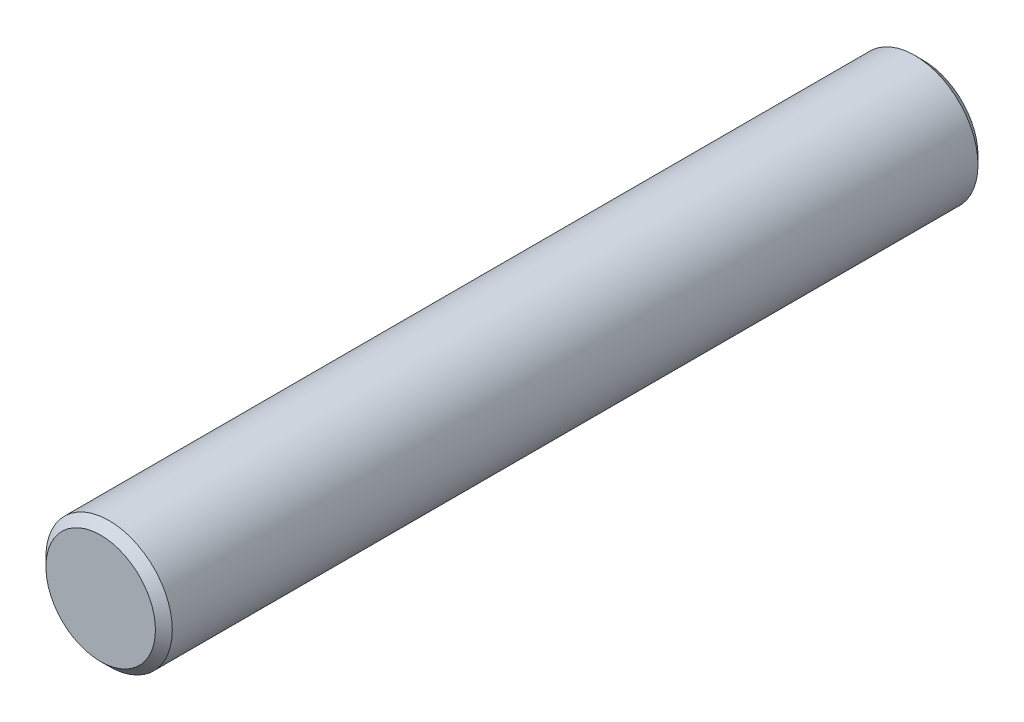
ISO-10303-21;
HEADER;
FILE_DESCRIPTION(('STEP AP214'),'2;1');
FILE_NAME('part.step','',(''),(''),'','','');
FILE_SCHEMA(('AUTOMOTIVE_DESIGN { 1 0 10303 214 1 1 1 1 }'));
ENDSEC;
DATA;
#1=APPLICATION_CONTEXT('core data for automotive mechanical design processes');
#2=APPLICATION_PROTOCOL_DEFINITION('international standard','automotive_design',2000,#1);
#3=PRODUCT_CONTEXT('',#1,'mechanical');
#4=PRODUCT('Part','Part','',(#3));
#5=PRODUCT_RELATED_PRODUCT_CATEGORY('part','',(#4));
#6=PRODUCT_DEFINITION_FORMATION('','',#4);
#7=PRODUCT_DEFINITION_CONTEXT('part definition',#1,'design');
#8=PRODUCT_DEFINITION('design','',#6,#7);
#9=PRODUCT_DEFINITION_SHAPE('','',#8);
#10=(LENGTH_UNIT() NAMED_UNIT(*) SI_UNIT(.MILLI.,.METRE.));
#11=(NAMED_UNIT(*) PLANE_ANGLE_UNIT() SI_UNIT($,.RADIAN.));
#12=(NAMED_UNIT(*) SI_UNIT($,.STERADIAN.) SOLID_ANGLE_UNIT());
#13=UNCERTAINTY_MEASURE_WITH_UNIT(LENGTH_MEASURE(1.E-05),#10,'distance_accuracy_value','');
#14=(GEOMETRIC_REPRESENTATION_CONTEXT(3) GLOBAL_UNCERTAINTY_ASSIGNED_CONTEXT((#13)) GLOBAL_UNIT_ASSIGNED_CONTEXT((#10,
#11,#12)) REPRESENTATION_CONTEXT('',''));
#15=CARTESIAN_POINT('',(0.,0.,0.));
#16=DIRECTION('',(0.,0.,1.));
#17=DIRECTION('',(1.,0.,0.));
#18=AXIS2_PLACEMENT_3D('',#15,#16,#17);
#19=CARTESIAN_POINT('',(2.40153394782797E-12,114.260861664054,-49.58806723));
#20=DIRECTION('',(0.,0.,1.));
#21=DIRECTION('',(1.,0.,0.));
#22=AXIS2_PLACEMENT_3D('',#19,#20,#21);
#23=CYLINDRICAL_SURFACE('',#22,3.81);
#24=CARTESIAN_POINT('',(2.40153394782797E-12,114.260861664054,-49.08006723));
#25=DIRECTION('',(0.,0.,1.));
#26=DIRECTION('',(1.,0.,0.));
#27=AXIS2_PLACEMENT_3D('',#24,#25,#26);
#28=CIRCLE('',#27,3.81);
#29=CARTESIAN_POINT('',(3.8100000000024,114.260861664054,-49.08006723));
#30=VERTEX_POINT('',#29);
#31=EDGE_CURVE('E41',#30,#30,#28,.T.);
#32=ORIENTED_EDGE('',*,*,#31,.T.);
#33=EDGE_LOOP('',(#32));
#34=FACE_BOUND('',#33,.T.);
#35=CARTESIAN_POINT('',(2.40153394782797E-12,114.260861664054,-0.508000000000002));
#36=DIRECTION('',(0.,0.,1.));
#37=DIRECTION('',(1.,0.,0.));
#38=AXIS2_PLACEMENT_3D('',#35,#36,#37);
#39=CIRCLE('',#38,3.81);
#40=CARTESIAN_POINT('',(3.8100000000024,114.260861664054,-0.508000000000002));
#41=VERTEX_POINT('',#40);
#42=EDGE_CURVE('E45',#41,#41,#39,.F.);
#43=ORIENTED_EDGE('',*,*,#42,.T.);
#44=EDGE_LOOP('',(#43));
#45=FACE_BOUND('',#44,.T.);
#46=ADVANCED_FACE('F30',(#34,#45),#23,.T.);
#47=CARTESIAN_POINT('',(2.40153394782797E-12,114.260861664054,-49.58806723));
#48=DIRECTION('',(0.,0.,1.));
#49=DIRECTION('',(1.,0.,0.));
#50=AXIS2_PLACEMENT_3D('',#47,#48,#49);
#51=PLANE('',#50);
#52=CARTESIAN_POINT('',(2.40153394782797E-12,114.260861664054,-49.58806723));
#53=DIRECTION('',(0.,0.,1.));
#54=DIRECTION('',(1.,0.,0.));
#55=AXIS2_PLACEMENT_3D('',#52,#53,#54);
#56=CIRCLE('',#55,3.302);
#57=CARTESIAN_POINT('',(3.3020000000024,114.260861664054,-49.58806723));
#58=VERTEX_POINT('',#57);
#59=EDGE_CURVE('E37',#58,#58,#56,.F.);
#60=ORIENTED_EDGE('',*,*,#59,.T.);
#61=EDGE_LOOP('',(#60));
#62=FACE_BOUND('',#61,.T.);
#63=ADVANCED_FACE('F61',(#62),#51,.F.);
#64=CARTESIAN_POINT('',(2.40153394782797E-12,114.260861664054,0.));
#65=DIRECTION('',(0.,0.,1.));
#66=DIRECTION('',(1.,0.,0.));
#67=AXIS2_PLACEMENT_3D('',#64,#65,#66);
#68=PLANE('',#67);
#69=CARTESIAN_POINT('',(2.40153394782797E-12,114.260861664054,0.));
#70=DIRECTION('',(0.,0.,1.));
#71=DIRECTION('',(1.,0.,0.));
#72=AXIS2_PLACEMENT_3D('',#69,#70,#71);
#73=CIRCLE('',#72,3.302);
#74=CARTESIAN_POINT('',(3.3020000000024,114.260861664054,0.));
#75=VERTEX_POINT('',#74);
#76=EDGE_CURVE('E10',#75,#75,#73,.T.);
#77=ORIENTED_EDGE('',*,*,#76,.T.);
#78=EDGE_LOOP('',(#77));
#79=FACE_BOUND('',#78,.T.);
#80=ADVANCED_FACE('F58',(#79),#68,.T.);
#81=CARTESIAN_POINT('',(2.40153394782797E-12,114.260861664054,-49.08006723));
#82=DIRECTION('',(0.,0.,1.));
#83=DIRECTION('',(1.,0.,0.));
#84=AXIS2_PLACEMENT_3D('',#81,#82,#83);
#85=CONICAL_SURFACE('',#84,3.81,0.78539816339744);
#86=ORIENTED_EDGE('',*,*,#59,.F.);
#87=EDGE_LOOP('',(#86));
#88=FACE_BOUND('',#87,.T.);
#89=ORIENTED_EDGE('',*,*,#31,.F.);
#90=EDGE_LOOP('',(#89));
#91=FACE_BOUND('',#90,.T.);
#92=ADVANCED_FACE('F54',(#88,#91),#85,.T.);
#93=CARTESIAN_POINT('',(2.40153394782797E-12,114.260861664054,0.));
#94=DIRECTION('',(0.,0.,-1.));
#95=DIRECTION('',(-1.,0.,0.));
#96=AXIS2_PLACEMENT_3D('',#93,#94,#95);
#97=CONICAL_SURFACE('',#96,3.302,0.785398163397447);
#98=ORIENTED_EDGE('',*,*,#42,.F.);
#99=EDGE_LOOP('',(#98));
#100=FACE_BOUND('',#99,.T.);
#101=ORIENTED_EDGE('',*,*,#76,.F.);
#102=EDGE_LOOP('',(#101));
#103=FACE_BOUND('',#102,.T.);
#104=ADVANCED_FACE('F32',(#100,#103),#97,.T.);
#105=CLOSED_SHELL('',(#46,#63,#80,#92,#104));
#106=MANIFOLD_SOLID_BREP('B2',#105);
#107=ADVANCED_BREP_SHAPE_REPRESENTATION('',(#18,#106),#14);
#108=SHAPE_DEFINITION_REPRESENTATION(#9,#107);
ENDSEC;
END-ISO-10303-21;
